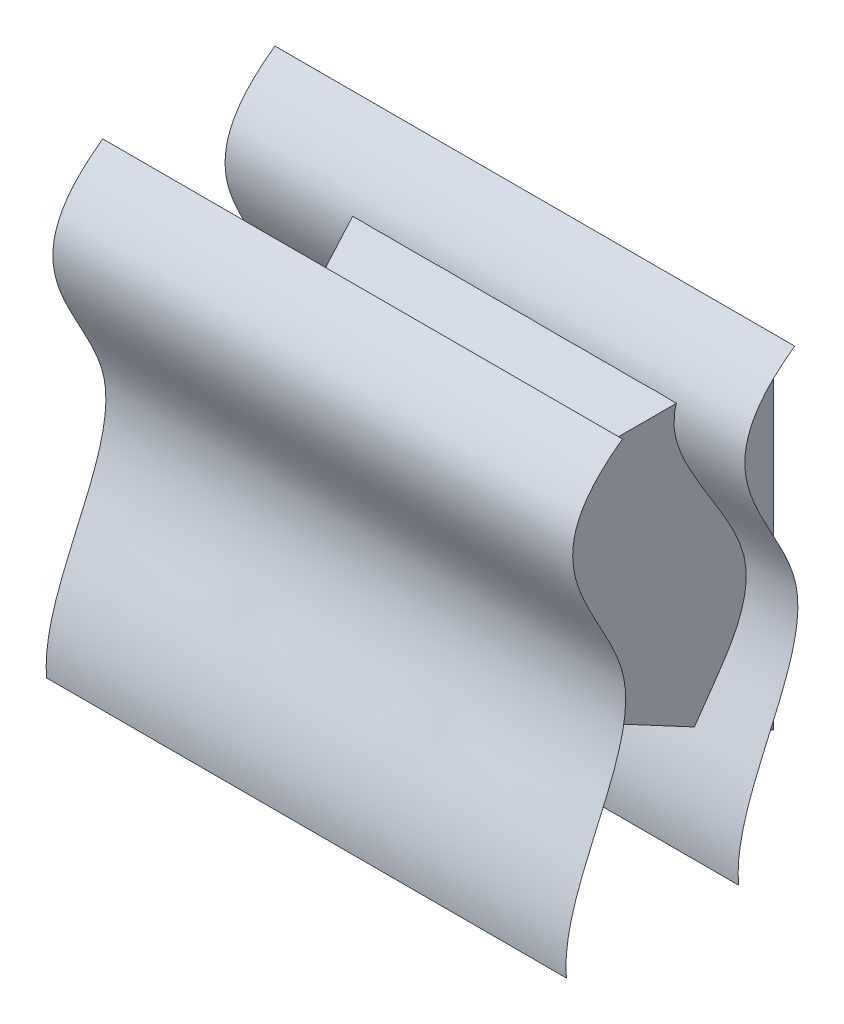
ISO-10303-21;
HEADER;
FILE_DESCRIPTION(('STEP AP214'),'2;1');
FILE_NAME('part.step','',(''),(''),'','','');
FILE_SCHEMA(('AUTOMOTIVE_DESIGN { 1 0 10303 214 1 1 1 1 }'));
ENDSEC;
DATA;
#1=APPLICATION_CONTEXT('core data for automotive mechanical design processes');
#2=APPLICATION_PROTOCOL_DEFINITION('international standard','automotive_design',2000,#1);
#3=PRODUCT_CONTEXT('',#1,'mechanical');
#4=PRODUCT('Part','Part','',(#3));
#5=PRODUCT_RELATED_PRODUCT_CATEGORY('part','',(#4));
#6=PRODUCT_DEFINITION_FORMATION('','',#4);
#7=PRODUCT_DEFINITION_CONTEXT('part definition',#1,'design');
#8=PRODUCT_DEFINITION('design','',#6,#7);
#9=PRODUCT_DEFINITION_SHAPE('','',#8);
#10=(LENGTH_UNIT() NAMED_UNIT(*) SI_UNIT(.MILLI.,.METRE.));
#11=(NAMED_UNIT(*) PLANE_ANGLE_UNIT() SI_UNIT($,.RADIAN.));
#12=(NAMED_UNIT(*) SI_UNIT($,.STERADIAN.) SOLID_ANGLE_UNIT());
#13=UNCERTAINTY_MEASURE_WITH_UNIT(LENGTH_MEASURE(1.E-05),#10,'distance_accuracy_value','');
#14=(GEOMETRIC_REPRESENTATION_CONTEXT(3) GLOBAL_UNCERTAINTY_ASSIGNED_CONTEXT((#13)) GLOBAL_UNIT_ASSIGNED_CONTEXT((#10,
#11,#12)) REPRESENTATION_CONTEXT('',''));
#15=CARTESIAN_POINT('',(0.,0.,0.));
#16=DIRECTION('',(0.,0.,1.));
#17=DIRECTION('',(1.,0.,0.));
#18=AXIS2_PLACEMENT_3D('',#15,#16,#17);
#19=CARTESIAN_POINT('',(-1.52422926449016,4.01313395986018,2.66228518325588));
#20=CARTESIAN_POINT('',(-1.52422926449016,-4.69428085802712,14.918114521293));
#21=CARTESIAN_POINT('',(-1.52422926449016,-20.0739613564952,-7.61610162007118));
#22=CARTESIAN_POINT('',(-1.52422926449016,-37.4957926802031,9.91644933925024));
#23=CARTESIAN_POINT('',(-1.52422926449016,-46.626542049612,9.14556550280767));
#24=B_SPLINE_CURVE_WITH_KNOTS('',3,(#19,#20,#21,#22,#23),.UNSPECIFIED.,.F.,.F.,(4,1,4),(0.,
0.484609084090598,1.),.UNSPECIFIED.);
#25=DIRECTION('',(1.,0.,0.));
#26=VECTOR('',#25,1.);
#27=SURFACE_OF_LINEAR_EXTRUSION('',#24,#26);
#28=CARTESIAN_POINT('',(48.4757707355098,4.01313395986018,2.66228518325588));
#29=CARTESIAN_POINT('',(48.4757707355098,-4.69428085802712,14.918114521293));
#30=CARTESIAN_POINT('',(48.4757707355098,-20.0739613564952,-7.61610162007118));
#31=CARTESIAN_POINT('',(48.4757707355098,-37.4957926802031,9.91644933925024));
#32=CARTESIAN_POINT('',(48.4757707355098,-46.626542049612,9.14556550280767));
#33=B_SPLINE_CURVE_WITH_KNOTS('',3,(#28,#29,#30,#31,#32),.UNSPECIFIED.,.F.,.F.,(4,1,4),(0.,
0.484609084090598,1.),.UNSPECIFIED.);
#34=CARTESIAN_POINT('',(48.4757707355098,4.01313395986018,2.66228518325588));
#35=VERTEX_POINT('',#34);
#36=CARTESIAN_POINT('',(48.4757707355098,-46.626542049612,9.14556550280767));
#37=VERTEX_POINT('',#36);
#38=EDGE_CURVE('E59',#35,#37,#33,.T.);
#39=ORIENTED_EDGE('',*,*,#38,.F.);
#40=DIRECTION('',(1.,0.,0.));
#41=VECTOR('',#40,1.);
#42=CARTESIAN_POINT('',(-1.52422926449016,4.01313395986018,2.66228518325588));
#43=LINE('',#42,#41);
#44=CARTESIAN_POINT('',(-11.5242292644902,4.01313395986018,2.66228518325588));
#45=VERTEX_POINT('',#44);
#46=EDGE_CURVE('E51',#45,#35,#43,.T.);
#47=ORIENTED_EDGE('',*,*,#46,.F.);
#48=CARTESIAN_POINT('',(-11.5242292644902,4.01313395986018,2.66228518325588));
#49=CARTESIAN_POINT('',(-11.5242292644902,-4.69428085802712,14.918114521293));
#50=CARTESIAN_POINT('',(-11.5242292644902,-20.0739613564952,-7.61610162007118));
#51=CARTESIAN_POINT('',(-11.5242292644902,-37.4957926802031,9.91644933925024));
#52=CARTESIAN_POINT('',(-11.5242292644902,-46.626542049612,9.14556550280767));
#53=B_SPLINE_CURVE_WITH_KNOTS('',3,(#48,#49,#50,#51,#52),.UNSPECIFIED.,.F.,.F.,(4,1,4),(0.,
0.484609084090598,1.),.UNSPECIFIED.);
#54=CARTESIAN_POINT('',(-11.5242292644902,-46.626542049612,9.14556550280767));
#55=VERTEX_POINT('',#54);
#56=EDGE_CURVE('E69',#45,#55,#53,.T.);
#57=ORIENTED_EDGE('',*,*,#56,.T.);
#58=DIRECTION('',(1.,0.,0.));
#59=VECTOR('',#58,1.);
#60=CARTESIAN_POINT('',(-1.52422926449016,-46.626542049612,9.14556550280767));
#61=LINE('',#60,#59);
#62=EDGE_CURVE('E12',#55,#37,#61,.T.);
#63=ORIENTED_EDGE('',*,*,#62,.T.);
#64=EDGE_LOOP('',(#39,#47,#57,#63));
#65=FACE_BOUND('',#64,.T.);
#66=ADVANCED_FACE('F49',(#65),#27,.T.);
#67=OPEN_SHELL('',(#66));
#68=SHELL_BASED_SURFACE_MODEL('B2',(#67));
#69=CARTESIAN_POINT('',(0.,6.18998145234106,24.0617093417306));
#70=CARTESIAN_POINT('',(0.,-2.51743336554624,36.3175386797677));
#71=CARTESIAN_POINT('',(0.,-17.8971138640143,13.7833225384035));
#72=CARTESIAN_POINT('',(0.,-35.3189451877222,31.3158734977249));
#73=CARTESIAN_POINT('',(0.,-44.4496945571311,30.5449896612824));
#74=B_SPLINE_CURVE_WITH_KNOTS('',3,(#69,#70,#71,#72,#73),.UNSPECIFIED.,.F.,.F.,(4,1,4),(0.,
0.484609084090598,1.),.UNSPECIFIED.);
#75=DIRECTION('',(1.,0.,0.));
#76=VECTOR('',#75,1.);
#77=SURFACE_OF_LINEAR_EXTRUSION('',#74,#76);
#78=CARTESIAN_POINT('',(50.,6.18998145234106,24.0617093417306));
#79=CARTESIAN_POINT('',(50.,-2.51743336554624,36.3175386797677));
#80=CARTESIAN_POINT('',(50.,-17.8971138640143,13.7833225384035));
#81=CARTESIAN_POINT('',(50.,-35.3189451877222,31.3158734977249));
#82=CARTESIAN_POINT('',(50.,-44.4496945571311,30.5449896612824));
#83=B_SPLINE_CURVE_WITH_KNOTS('',3,(#78,#79,#80,#81,#82),.UNSPECIFIED.,.F.,.F.,(4,1,4),(0.,
0.484609084090598,1.),.UNSPECIFIED.);
#84=CARTESIAN_POINT('',(50.,6.18998145234106,24.0617093417306));
#85=VERTEX_POINT('',#84);
#86=CARTESIAN_POINT('',(50.,-44.4496945571311,30.5449896612824));
#87=VERTEX_POINT('',#86);
#88=EDGE_CURVE('E129',#85,#87,#83,.T.);
#89=ORIENTED_EDGE('',*,*,#88,.F.);
#90=DIRECTION('',(1.,0.,0.));
#91=VECTOR('',#90,1.);
#92=CARTESIAN_POINT('',(0.,6.18998145234106,24.0617093417306));
#93=LINE('',#92,#91);
#94=CARTESIAN_POINT('',(-10.,6.18998145234106,24.0617093417306));
#95=VERTEX_POINT('',#94);
#96=EDGE_CURVE('E121',#95,#85,#93,.T.);
#97=ORIENTED_EDGE('',*,*,#96,.F.);
#98=CARTESIAN_POINT('',(-10.,6.18998145234106,24.0617093417306));
#99=CARTESIAN_POINT('',(-10.,-2.51743336554624,36.3175386797677));
#100=CARTESIAN_POINT('',(-10.,-17.8971138640143,13.7833225384035));
#101=CARTESIAN_POINT('',(-10.,-35.3189451877222,31.3158734977249));
#102=CARTESIAN_POINT('',(-10.,-44.4496945571311,30.5449896612824));
#103=B_SPLINE_CURVE_WITH_KNOTS('',3,(#98,#99,#100,#101,#102),.UNSPECIFIED.,.F.,.F.,(4,1,4),(0.,
0.484609084090598,1.),.UNSPECIFIED.);
#104=CARTESIAN_POINT('',(-10.,-44.4496945571311,30.5449896612824));
#105=VERTEX_POINT('',#104);
#106=EDGE_CURVE('E139',#95,#105,#103,.T.);
#107=ORIENTED_EDGE('',*,*,#106,.T.);
#108=DIRECTION('',(1.,0.,0.));
#109=VECTOR('',#108,1.);
#110=CARTESIAN_POINT('',(0.,-44.4496945571311,30.5449896612824));
#111=LINE('',#110,#109);
#112=EDGE_CURVE('E47',#105,#87,#111,.T.);
#113=ORIENTED_EDGE('',*,*,#112,.T.);
#114=EDGE_LOOP('',(#89,#97,#107,#113));
#115=FACE_BOUND('',#114,.T.);
#116=ADVANCED_FACE('F119',(#115),#77,.T.);
#117=OPEN_SHELL('',(#116));
#118=SHELL_BASED_SURFACE_MODEL('B6',(#117));
#119=CARTESIAN_POINT('',(0.,0.,0.));
#120=DIRECTION('',(-0.939692620785908,0.,0.342020143325669));
#121=DIRECTION('',(0.342020143325669,0.,0.939692620785908));
#122=AXIS2_PLACEMENT_3D('',#119,#120,#121);
#123=PLANE('',#122);
#124=DIRECTION('',(0.,-1.,0.));
#125=VECTOR('',#124,1.);
#126=CARTESIAN_POINT('',(0.,0.,0.));
#127=LINE('',#126,#125);
#128=CARTESIAN_POINT('',(0.,0.,0.));
#129=VERTEX_POINT('',#128);
#130=CARTESIAN_POINT('',(0.,-38.2597131047897,0.));
#131=VERTEX_POINT('',#130);
#132=EDGE_CURVE('E225',#129,#131,#127,.T.);
#133=ORIENTED_EDGE('',*,*,#132,.T.);
#134=DIRECTION('',(-0.323615577118185,-0.323615577118185,-0.889126490715988));
#135=VECTOR('',#134,1.);
#136=CARTESIAN_POINT('',(0.,-38.2597131047897,0.));
#137=LINE('',#136,#135);
#138=CARTESIAN_POINT('',(7.27940468532406,-30.9803084194656,20.));
#139=VERTEX_POINT('',#138);
#140=EDGE_CURVE('E117',#139,#131,#137,.T.);
#141=ORIENTED_EDGE('',*,*,#140,.F.);
#142=DIRECTION('',(0.,1.,0.));
#143=VECTOR('',#142,1.);
#144=CARTESIAN_POINT('',(7.27940468532406,0.,20.));
#145=LINE('',#144,#143);
#146=CARTESIAN_POINT('',(7.27940468532406,-7.27940468532406,20.));
#147=VERTEX_POINT('',#146);
#148=EDGE_CURVE('E241',#147,#139,#145,.F.);
#149=ORIENTED_EDGE('',*,*,#148,.F.);
#150=DIRECTION('',(-0.323615577118185,0.323615577118185,-0.889126490715988));
#151=VECTOR('',#150,1.);
#152=CARTESIAN_POINT('',(0.,0.,0.));
#153=LINE('',#152,#151);
#154=EDGE_CURVE('E236',#147,#129,#153,.T.);
#155=ORIENTED_EDGE('',*,*,#154,.T.);
#156=EDGE_LOOP('',(#133,#141,#149,#155));
#157=FACE_BOUND('',#156,.T.);
#158=ADVANCED_FACE('F179',(#157),#123,.T.);
#159=CARTESIAN_POINT('',(0.,-38.2597131047897,0.));
#160=DIRECTION('',(0.,-0.939692620785908,0.342020143325669));
#161=DIRECTION('',(0.,-0.342020143325669,-0.939692620785908));
#162=AXIS2_PLACEMENT_3D('',#159,#160,#161);
#163=PLANE('',#162);
#164=DIRECTION('',(1.,0.,0.));
#165=VECTOR('',#164,1.);
#166=CARTESIAN_POINT('',(0.,-38.2597131047897,0.));
#167=LINE('',#166,#165);
#168=CARTESIAN_POINT('',(43.3507233163141,-38.2597131047897,0.));
#169=VERTEX_POINT('',#168);
#170=EDGE_CURVE('E221',#131,#169,#167,.T.);
#171=ORIENTED_EDGE('',*,*,#170,.T.);
#172=DIRECTION('',(0.323615577118185,-0.323615577118185,-0.889126490715988));
#173=VECTOR('',#172,1.);
#174=CARTESIAN_POINT('',(39.3438967445105,-34.2528865329861,11.0086655297012));
#175=LINE('',#174,#173);
#176=CARTESIAN_POINT('',(36.0713186309901,-30.9803084194656,20.));
#177=VERTEX_POINT('',#176);
#178=EDGE_CURVE('E188',#177,#169,#175,.T.);
#179=ORIENTED_EDGE('',*,*,#178,.F.);
#180=DIRECTION('',(-1.,0.,0.));
#181=VECTOR('',#180,1.);
#182=CARTESIAN_POINT('',(0.,-30.9803084194656,20.));
#183=LINE('',#182,#181);
#184=EDGE_CURVE('E232',#139,#177,#183,.F.);
#185=ORIENTED_EDGE('',*,*,#184,.F.);
#186=ORIENTED_EDGE('',*,*,#140,.T.);
#187=EDGE_LOOP('',(#171,#179,#185,#186));
#188=FACE_BOUND('',#187,.T.);
#189=ADVANCED_FACE('F181',(#188),#163,.T.);
#190=CARTESIAN_POINT('',(43.3507233163141,0.,0.));
#191=DIRECTION('',(0.939692620785908,0.,0.342020143325669));
#192=DIRECTION('',(0.342020143325669,0.,-0.939692620785908));
#193=AXIS2_PLACEMENT_3D('',#190,#191,#192);
#194=PLANE('',#193);
#195=DIRECTION('',(0.,1.,0.));
#196=VECTOR('',#195,1.);
#197=CARTESIAN_POINT('',(43.3507233163141,0.,0.));
#198=LINE('',#197,#196);
#199=CARTESIAN_POINT('',(43.3507233163141,0.,0.));
#200=VERTEX_POINT('',#199);
#201=EDGE_CURVE('E226',#169,#200,#198,.T.);
#202=ORIENTED_EDGE('',*,*,#201,.T.);
#203=DIRECTION('',(0.323615577118185,0.323615577118185,-0.889126490715988));
#204=VECTOR('',#203,1.);
#205=CARTESIAN_POINT('',(38.8107303055205,-4.53999301079362,12.4735282816372));
#206=LINE('',#205,#204);
#207=CARTESIAN_POINT('',(36.0713186309901,-7.27940468532406,20.));
#208=VERTEX_POINT('',#207);
#209=EDGE_CURVE('E244',#208,#200,#206,.T.);
#210=ORIENTED_EDGE('',*,*,#209,.F.);
#211=DIRECTION('',(0.,-1.,0.));
#212=VECTOR('',#211,1.);
#213=CARTESIAN_POINT('',(36.0713186309901,0.,20.));
#214=LINE('',#213,#212);
#215=EDGE_CURVE('E200',#177,#208,#214,.F.);
#216=ORIENTED_EDGE('',*,*,#215,.F.);
#217=ORIENTED_EDGE('',*,*,#178,.T.);
#218=EDGE_LOOP('',(#202,#210,#216,#217));
#219=FACE_BOUND('',#218,.T.);
#220=ADVANCED_FACE('F251',(#219),#194,.T.);
#221=CARTESIAN_POINT('',(0.,0.,0.));
#222=DIRECTION('',(0.,0.939692620785908,0.342020143325669));
#223=DIRECTION('',(0.,-0.342020143325669,0.939692620785908));
#224=AXIS2_PLACEMENT_3D('',#221,#222,#223);
#225=PLANE('',#224);
#226=DIRECTION('',(-1.,0.,0.));
#227=VECTOR('',#226,1.);
#228=CARTESIAN_POINT('',(0.,0.,0.));
#229=LINE('',#228,#227);
#230=EDGE_CURVE('E240',#200,#129,#229,.T.);
#231=ORIENTED_EDGE('',*,*,#230,.T.);
#232=ORIENTED_EDGE('',*,*,#154,.F.);
#233=DIRECTION('',(1.,0.,0.));
#234=VECTOR('',#233,1.);
#235=CARTESIAN_POINT('',(0.,-7.27940468532406,20.));
#236=LINE('',#235,#234);
#237=EDGE_CURVE('E183',#208,#147,#236,.F.);
#238=ORIENTED_EDGE('',*,*,#237,.F.);
#239=ORIENTED_EDGE('',*,*,#209,.T.);
#240=EDGE_LOOP('',(#231,#232,#238,#239));
#241=FACE_BOUND('',#240,.T.);
#242=ADVANCED_FACE('F253',(#241),#225,.T.);
#243=CARTESIAN_POINT('',(0.,0.,20.));
#244=DIRECTION('',(0.,0.,1.));
#245=DIRECTION('',(1.,0.,0.));
#246=AXIS2_PLACEMENT_3D('',#243,#244,#245);
#247=PLANE('',#246);
#248=ORIENTED_EDGE('',*,*,#148,.T.);
#249=ORIENTED_EDGE('',*,*,#184,.T.);
#250=ORIENTED_EDGE('',*,*,#215,.T.);
#251=ORIENTED_EDGE('',*,*,#237,.T.);
#252=EDGE_LOOP('',(#248,#249,#250,#251));
#253=FACE_BOUND('',#252,.T.);
#254=ADVANCED_FACE('F249',(#253),#247,.T.);
#255=CARTESIAN_POINT('',(0.,0.,0.));
#256=DIRECTION('',(0.,0.,1.));
#257=DIRECTION('',(1.,0.,0.));
#258=AXIS2_PLACEMENT_3D('',#255,#256,#257);
#259=PLANE('',#258);
#260=ORIENTED_EDGE('',*,*,#132,.F.);
#261=ORIENTED_EDGE('',*,*,#230,.F.);
#262=ORIENTED_EDGE('',*,*,#201,.F.);
#263=ORIENTED_EDGE('',*,*,#170,.F.);
#264=EDGE_LOOP('',(#260,#261,#262,#263));
#265=FACE_BOUND('',#264,.T.);
#266=ADVANCED_FACE('F222',(#265),#259,.F.);
#267=CLOSED_SHELL('',(#158,#189,#220,#242,#254,#266));
#268=MANIFOLD_SOLID_BREP('B41',#267);
#269=ADVANCED_BREP_SHAPE_REPRESENTATION('',(#18,#268),#14);
#270=MANIFOLD_SURFACE_SHAPE_REPRESENTATION('',(#18,#68,#118),#14);
#271=SHAPE_REPRESENTATION('',(#18),#14);
#272=SHAPE_DEFINITION_REPRESENTATION(#9,#271);
#273=SHAPE_REPRESENTATION_RELATIONSHIP('','',#271,#269);
#274=SHAPE_REPRESENTATION_RELATIONSHIP('','',#271,#270);
ENDSEC;
END-ISO-10303-21;
